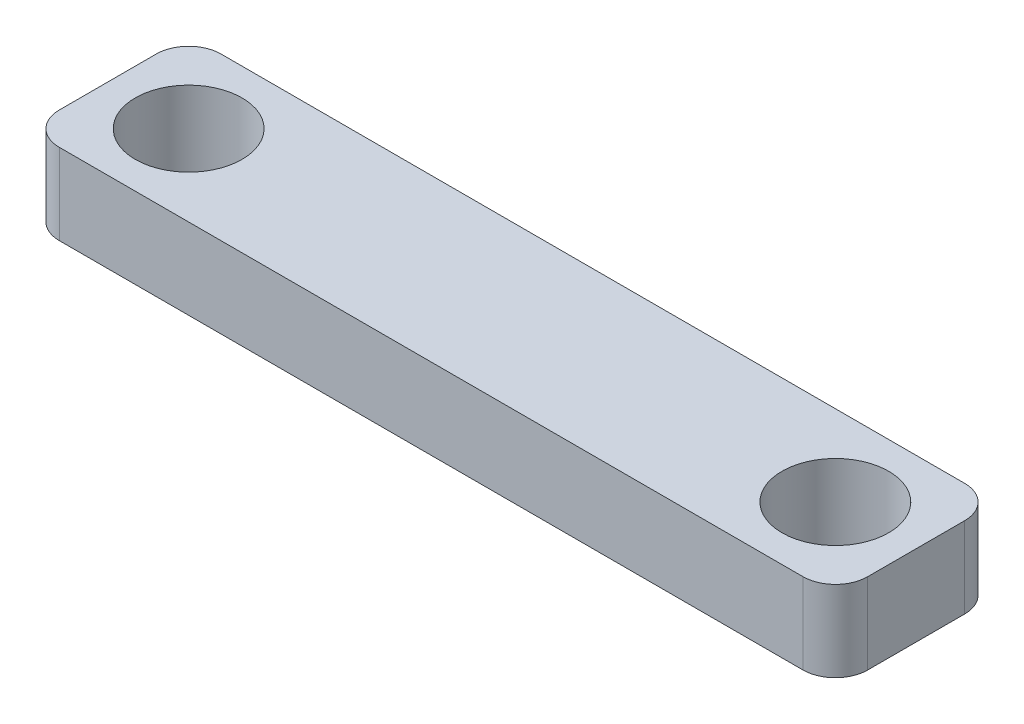
ISO-10303-21;
HEADER;
FILE_DESCRIPTION(('STEP AP214'),'2;1');
FILE_NAME('part.step','',(''),(''),'','','');
FILE_SCHEMA(('AUTOMOTIVE_DESIGN { 1 0 10303 214 1 1 1 1 }'));
ENDSEC;
DATA;
#1=APPLICATION_CONTEXT('core data for automotive mechanical design processes');
#2=APPLICATION_PROTOCOL_DEFINITION('international standard','automotive_design',2000,#1);
#3=PRODUCT_CONTEXT('',#1,'mechanical');
#4=PRODUCT('Part','Part','',(#3));
#5=PRODUCT_RELATED_PRODUCT_CATEGORY('part','',(#4));
#6=PRODUCT_DEFINITION_FORMATION('','',#4);
#7=PRODUCT_DEFINITION_CONTEXT('part definition',#1,'design');
#8=PRODUCT_DEFINITION('design','',#6,#7);
#9=PRODUCT_DEFINITION_SHAPE('','',#8);
#10=(LENGTH_UNIT() NAMED_UNIT(*) SI_UNIT(.MILLI.,.METRE.));
#11=(NAMED_UNIT(*) PLANE_ANGLE_UNIT() SI_UNIT($,.RADIAN.));
#12=(NAMED_UNIT(*) SI_UNIT($,.STERADIAN.) SOLID_ANGLE_UNIT());
#13=UNCERTAINTY_MEASURE_WITH_UNIT(LENGTH_MEASURE(1.E-05),#10,'distance_accuracy_value','');
#14=(GEOMETRIC_REPRESENTATION_CONTEXT(3) GLOBAL_UNCERTAINTY_ASSIGNED_CONTEXT((#13)) GLOBAL_UNIT_ASSIGNED_CONTEXT((#10,
#11,#12)) REPRESENTATION_CONTEXT('',''));
#15=CARTESIAN_POINT('',(0.,0.,0.));
#16=DIRECTION('',(0.,0.,1.));
#17=DIRECTION('',(1.,0.,0.));
#18=AXIS2_PLACEMENT_3D('',#15,#16,#17);
#19=CARTESIAN_POINT('',(0.,25.,0.));
#20=DIRECTION('',(0.,-1.,0.));
#21=DIRECTION('',(0.,0.,-1.));
#22=AXIS2_PLACEMENT_3D('',#19,#20,#21);
#23=PLANE('',#22);
#24=DIRECTION('',(-1.,0.,0.));
#25=VECTOR('',#24,1.);
#26=CARTESIAN_POINT('',(0.,25.,-50.));
#27=LINE('',#26,#25);
#28=CARTESIAN_POINT('',(240.,25.,-50.));
#29=VERTEX_POINT('',#28);
#30=CARTESIAN_POINT('',(10.,25.,-50.));
#31=VERTEX_POINT('',#30);
#32=EDGE_CURVE('E146',#29,#31,#27,.T.);
#33=ORIENTED_EDGE('',*,*,#32,.T.);
#34=CARTESIAN_POINT('',(10.,25.,-40.));
#35=DIRECTION('',(0.,-1.,0.));
#36=DIRECTION('',(0.,0.,-1.));
#37=AXIS2_PLACEMENT_3D('',#34,#35,#36);
#38=CIRCLE('',#37,10.);
#39=CARTESIAN_POINT('',(0.,25.,-40.));
#40=VERTEX_POINT('',#39);
#41=EDGE_CURVE('E176',#31,#40,#38,.F.);
#42=ORIENTED_EDGE('',*,*,#41,.T.);
#43=DIRECTION('',(0.,0.,1.));
#44=VECTOR('',#43,1.);
#45=CARTESIAN_POINT('',(0.,25.,0.));
#46=LINE('',#45,#44);
#47=CARTESIAN_POINT('',(0.,25.,-10.));
#48=VERTEX_POINT('',#47);
#49=EDGE_CURVE('E125',#40,#48,#46,.T.);
#50=ORIENTED_EDGE('',*,*,#49,.T.);
#51=CARTESIAN_POINT('',(10.,25.,-10.));
#52=DIRECTION('',(0.,-1.,0.));
#53=DIRECTION('',(0.,0.,-1.));
#54=AXIS2_PLACEMENT_3D('',#51,#52,#53);
#55=CIRCLE('',#54,10.);
#56=CARTESIAN_POINT('',(10.,25.,0.));
#57=VERTEX_POINT('',#56);
#58=EDGE_CURVE('E173',#48,#57,#55,.F.);
#59=ORIENTED_EDGE('',*,*,#58,.T.);
#60=DIRECTION('',(1.,0.,0.));
#61=VECTOR('',#60,1.);
#62=CARTESIAN_POINT('',(0.,25.,0.));
#63=LINE('',#62,#61);
#64=CARTESIAN_POINT('',(240.,25.,0.));
#65=VERTEX_POINT('',#64);
#66=EDGE_CURVE('E202',#57,#65,#63,.T.);
#67=ORIENTED_EDGE('',*,*,#66,.T.);
#68=CARTESIAN_POINT('',(240.,25.,-10.));
#69=DIRECTION('',(0.,-1.,0.));
#70=DIRECTION('',(0.,0.,-1.));
#71=AXIS2_PLACEMENT_3D('',#68,#69,#70);
#72=CIRCLE('',#71,10.);
#73=CARTESIAN_POINT('',(250.,25.,-10.));
#74=VERTEX_POINT('',#73);
#75=EDGE_CURVE('E59',#65,#74,#72,.F.);
#76=ORIENTED_EDGE('',*,*,#75,.T.);
#77=DIRECTION('',(0.,0.,-1.));
#78=VECTOR('',#77,1.);
#79=CARTESIAN_POINT('',(250.,25.,0.));
#80=LINE('',#79,#78);
#81=CARTESIAN_POINT('',(250.,25.,-40.));
#82=VERTEX_POINT('',#81);
#83=EDGE_CURVE('E190',#74,#82,#80,.T.);
#84=ORIENTED_EDGE('',*,*,#83,.T.);
#85=CARTESIAN_POINT('',(240.,25.,-40.));
#86=DIRECTION('',(0.,-1.,0.));
#87=DIRECTION('',(0.,0.,-1.));
#88=AXIS2_PLACEMENT_3D('',#85,#86,#87);
#89=CIRCLE('',#88,10.);
#90=EDGE_CURVE('E170',#82,#29,#89,.F.);
#91=ORIENTED_EDGE('',*,*,#90,.T.);
#92=EDGE_LOOP('',(#33,#42,#50,#59,#67,#76,#84,#91));
#93=FACE_BOUND('',#92,.T.);
#94=CARTESIAN_POINT('',(25.,25.,-25.));
#95=DIRECTION('',(0.,1.,0.));
#96=DIRECTION('',(0.,0.,1.));
#97=AXIS2_PLACEMENT_3D('',#94,#95,#96);
#98=CIRCLE('',#97,16.5);
#99=CARTESIAN_POINT('',(25.,25.,-8.5));
#100=VERTEX_POINT('',#99);
#101=EDGE_CURVE('E135',#100,#100,#98,.T.);
#102=ORIENTED_EDGE('',*,*,#101,.F.);
#103=EDGE_LOOP('',(#102));
#104=FACE_BOUND('',#103,.T.);
#105=CARTESIAN_POINT('',(225.,25.,-25.));
#106=DIRECTION('',(0.,1.,0.));
#107=DIRECTION('',(0.,0.,1.));
#108=AXIS2_PLACEMENT_3D('',#105,#106,#107);
#109=CIRCLE('',#108,16.5);
#110=CARTESIAN_POINT('',(225.,25.,-8.50000000000001));
#111=VERTEX_POINT('',#110);
#112=EDGE_CURVE('E210',#111,#111,#109,.T.);
#113=ORIENTED_EDGE('',*,*,#112,.F.);
#114=EDGE_LOOP('',(#113));
#115=FACE_BOUND('',#114,.T.);
#116=ADVANCED_FACE('F38',(#93,#104,#115),#23,.F.);
#117=CARTESIAN_POINT('',(0.,0.,0.));
#118=DIRECTION('',(0.,-1.,0.));
#119=DIRECTION('',(0.,0.,-1.));
#120=AXIS2_PLACEMENT_3D('',#117,#118,#119);
#121=PLANE('',#120);
#122=CARTESIAN_POINT('',(25.,0.,-25.));
#123=DIRECTION('',(0.,1.,0.));
#124=DIRECTION('',(0.,0.,1.));
#125=AXIS2_PLACEMENT_3D('',#122,#123,#124);
#126=CIRCLE('',#125,16.5);
#127=CARTESIAN_POINT('',(25.,0.,-8.5));
#128=VERTEX_POINT('',#127);
#129=EDGE_CURVE('E143',#128,#128,#126,.T.);
#130=ORIENTED_EDGE('',*,*,#129,.T.);
#131=EDGE_LOOP('',(#130));
#132=FACE_BOUND('',#131,.T.);
#133=DIRECTION('',(0.,0.,1.));
#134=VECTOR('',#133,1.);
#135=CARTESIAN_POINT('',(0.,0.,0.));
#136=LINE('',#135,#134);
#137=CARTESIAN_POINT('',(0.,0.,-40.));
#138=VERTEX_POINT('',#137);
#139=CARTESIAN_POINT('',(0.,0.,-10.));
#140=VERTEX_POINT('',#139);
#141=EDGE_CURVE('E122',#138,#140,#136,.T.);
#142=ORIENTED_EDGE('',*,*,#141,.F.);
#143=CARTESIAN_POINT('',(10.,0.,-40.));
#144=DIRECTION('',(0.,-1.,0.));
#145=DIRECTION('',(0.,0.,-1.));
#146=AXIS2_PLACEMENT_3D('',#143,#144,#145);
#147=CIRCLE('',#146,10.);
#148=CARTESIAN_POINT('',(10.,0.,-50.));
#149=VERTEX_POINT('',#148);
#150=EDGE_CURVE('E104',#138,#149,#147,.T.);
#151=ORIENTED_EDGE('',*,*,#150,.T.);
#152=DIRECTION('',(-1.,0.,0.));
#153=VECTOR('',#152,1.);
#154=CARTESIAN_POINT('',(0.,0.,-50.));
#155=LINE('',#154,#153);
#156=CARTESIAN_POINT('',(240.,0.,-50.));
#157=VERTEX_POINT('',#156);
#158=EDGE_CURVE('E151',#157,#149,#155,.T.);
#159=ORIENTED_EDGE('',*,*,#158,.F.);
#160=CARTESIAN_POINT('',(240.,0.,-40.));
#161=DIRECTION('',(0.,-1.,0.));
#162=DIRECTION('',(0.,0.,-1.));
#163=AXIS2_PLACEMENT_3D('',#160,#161,#162);
#164=CIRCLE('',#163,10.);
#165=CARTESIAN_POINT('',(250.,0.,-40.));
#166=VERTEX_POINT('',#165);
#167=EDGE_CURVE('E158',#157,#166,#164,.T.);
#168=ORIENTED_EDGE('',*,*,#167,.T.);
#169=DIRECTION('',(0.,0.,-1.));
#170=VECTOR('',#169,1.);
#171=CARTESIAN_POINT('',(250.,0.,0.));
#172=LINE('',#171,#170);
#173=CARTESIAN_POINT('',(250.,0.,-10.));
#174=VERTEX_POINT('',#173);
#175=EDGE_CURVE('E140',#174,#166,#172,.T.);
#176=ORIENTED_EDGE('',*,*,#175,.F.);
#177=CARTESIAN_POINT('',(240.,0.,-10.));
#178=DIRECTION('',(0.,-1.,0.));
#179=DIRECTION('',(0.,0.,-1.));
#180=AXIS2_PLACEMENT_3D('',#177,#178,#179);
#181=CIRCLE('',#180,10.);
#182=CARTESIAN_POINT('',(240.,0.,0.));
#183=VERTEX_POINT('',#182);
#184=EDGE_CURVE('E127',#174,#183,#181,.T.);
#185=ORIENTED_EDGE('',*,*,#184,.T.);
#186=DIRECTION('',(1.,0.,0.));
#187=VECTOR('',#186,1.);
#188=CARTESIAN_POINT('',(0.,0.,0.));
#189=LINE('',#188,#187);
#190=CARTESIAN_POINT('',(10.,0.,0.));
#191=VERTEX_POINT('',#190);
#192=EDGE_CURVE('E134',#191,#183,#189,.T.);
#193=ORIENTED_EDGE('',*,*,#192,.F.);
#194=CARTESIAN_POINT('',(10.,0.,-10.));
#195=DIRECTION('',(0.,-1.,0.));
#196=DIRECTION('',(0.,0.,-1.));
#197=AXIS2_PLACEMENT_3D('',#194,#195,#196);
#198=CIRCLE('',#197,10.);
#199=EDGE_CURVE('E116',#191,#140,#198,.T.);
#200=ORIENTED_EDGE('',*,*,#199,.T.);
#201=EDGE_LOOP('',(#142,#151,#159,#168,#176,#185,#193,#200));
#202=FACE_BOUND('',#201,.T.);
#203=CARTESIAN_POINT('',(225.,0.,-25.));
#204=DIRECTION('',(0.,1.,0.));
#205=DIRECTION('',(0.,0.,1.));
#206=AXIS2_PLACEMENT_3D('',#203,#204,#205);
#207=CIRCLE('',#206,16.5);
#208=CARTESIAN_POINT('',(225.,0.,-8.50000000000001));
#209=VERTEX_POINT('',#208);
#210=EDGE_CURVE('E212',#209,#209,#207,.T.);
#211=ORIENTED_EDGE('',*,*,#210,.T.);
#212=EDGE_LOOP('',(#211));
#213=FACE_BOUND('',#212,.T.);
#214=ADVANCED_FACE('F130',(#132,#202,#213),#121,.T.);
#215=CARTESIAN_POINT('',(0.,25.,0.));
#216=DIRECTION('',(1.,0.,0.));
#217=DIRECTION('',(0.,0.,-1.));
#218=AXIS2_PLACEMENT_3D('',#215,#216,#217);
#219=PLANE('',#218);
#220=ORIENTED_EDGE('',*,*,#49,.F.);
#221=DIRECTION('',(0.,-1.,0.));
#222=VECTOR('',#221,1.);
#223=CARTESIAN_POINT('',(0.,25.,-40.));
#224=LINE('',#223,#222);
#225=EDGE_CURVE('E108',#40,#138,#224,.T.);
#226=ORIENTED_EDGE('',*,*,#225,.T.);
#227=ORIENTED_EDGE('',*,*,#141,.T.);
#228=DIRECTION('',(0.,-1.,0.));
#229=VECTOR('',#228,1.);
#230=CARTESIAN_POINT('',(0.,25.,-10.));
#231=LINE('',#230,#229);
#232=EDGE_CURVE('E128',#140,#48,#231,.F.);
#233=ORIENTED_EDGE('',*,*,#232,.T.);
#234=EDGE_LOOP('',(#220,#226,#227,#233));
#235=FACE_BOUND('',#234,.T.);
#236=ADVANCED_FACE('F121',(#235),#219,.F.);
#237=CARTESIAN_POINT('',(0.,25.,0.));
#238=DIRECTION('',(0.,0.,-1.));
#239=DIRECTION('',(-1.,0.,0.));
#240=AXIS2_PLACEMENT_3D('',#237,#238,#239);
#241=PLANE('',#240);
#242=ORIENTED_EDGE('',*,*,#66,.F.);
#243=DIRECTION('',(0.,-1.,0.));
#244=VECTOR('',#243,1.);
#245=CARTESIAN_POINT('',(10.,25.,0.));
#246=LINE('',#245,#244);
#247=EDGE_CURVE('E182',#57,#191,#246,.T.);
#248=ORIENTED_EDGE('',*,*,#247,.T.);
#249=ORIENTED_EDGE('',*,*,#192,.T.);
#250=DIRECTION('',(0.,-1.,0.));
#251=VECTOR('',#250,1.);
#252=CARTESIAN_POINT('',(240.,25.,0.));
#253=LINE('',#252,#251);
#254=EDGE_CURVE('E179',#183,#65,#253,.F.);
#255=ORIENTED_EDGE('',*,*,#254,.T.);
#256=EDGE_LOOP('',(#242,#248,#249,#255));
#257=FACE_BOUND('',#256,.T.);
#258=ADVANCED_FACE('F240',(#257),#241,.F.);
#259=CARTESIAN_POINT('',(250.,25.,0.));
#260=DIRECTION('',(-1.,0.,0.));
#261=DIRECTION('',(0.,0.,1.));
#262=AXIS2_PLACEMENT_3D('',#259,#260,#261);
#263=PLANE('',#262);
#264=ORIENTED_EDGE('',*,*,#175,.T.);
#265=DIRECTION('',(0.,-1.,0.));
#266=VECTOR('',#265,1.);
#267=CARTESIAN_POINT('',(250.,25.,-40.));
#268=LINE('',#267,#266);
#269=EDGE_CURVE('E11',#166,#82,#268,.F.);
#270=ORIENTED_EDGE('',*,*,#269,.T.);
#271=ORIENTED_EDGE('',*,*,#83,.F.);
#272=DIRECTION('',(0.,-1.,0.));
#273=VECTOR('',#272,1.);
#274=CARTESIAN_POINT('',(250.,25.,-10.));
#275=LINE('',#274,#273);
#276=EDGE_CURVE('E47',#74,#174,#275,.T.);
#277=ORIENTED_EDGE('',*,*,#276,.T.);
#278=EDGE_LOOP('',(#264,#270,#271,#277));
#279=FACE_BOUND('',#278,.T.);
#280=ADVANCED_FACE('F189',(#279),#263,.F.);
#281=CARTESIAN_POINT('',(0.,25.,-50.));
#282=DIRECTION('',(0.,0.,1.));
#283=DIRECTION('',(1.,0.,0.));
#284=AXIS2_PLACEMENT_3D('',#281,#282,#283);
#285=PLANE('',#284);
#286=ORIENTED_EDGE('',*,*,#158,.T.);
#287=DIRECTION('',(0.,-1.,0.));
#288=VECTOR('',#287,1.);
#289=CARTESIAN_POINT('',(10.,25.,-50.));
#290=LINE('',#289,#288);
#291=EDGE_CURVE('E109',#149,#31,#290,.F.);
#292=ORIENTED_EDGE('',*,*,#291,.T.);
#293=ORIENTED_EDGE('',*,*,#32,.F.);
#294=DIRECTION('',(0.,-1.,0.));
#295=VECTOR('',#294,1.);
#296=CARTESIAN_POINT('',(240.,25.,-50.));
#297=LINE('',#296,#295);
#298=EDGE_CURVE('E115',#29,#157,#297,.T.);
#299=ORIENTED_EDGE('',*,*,#298,.T.);
#300=EDGE_LOOP('',(#286,#292,#293,#299));
#301=FACE_BOUND('',#300,.T.);
#302=ADVANCED_FACE('F198',(#301),#285,.F.);
#303=CARTESIAN_POINT('',(25.,25.,-25.));
#304=DIRECTION('',(0.,-1.,0.));
#305=DIRECTION('',(0.,0.,-1.));
#306=AXIS2_PLACEMENT_3D('',#303,#304,#305);
#307=CYLINDRICAL_SURFACE('',#306,16.5);
#308=ORIENTED_EDGE('',*,*,#101,.T.);
#309=EDGE_LOOP('',(#308));
#310=FACE_BOUND('',#309,.T.);
#311=ORIENTED_EDGE('',*,*,#129,.F.);
#312=EDGE_LOOP('',(#311));
#313=FACE_BOUND('',#312,.T.);
#314=ADVANCED_FACE('F233',(#310,#313),#307,.F.);
#315=CARTESIAN_POINT('',(225.,25.,-25.));
#316=DIRECTION('',(0.,-1.,0.));
#317=DIRECTION('',(0.,0.,-1.));
#318=AXIS2_PLACEMENT_3D('',#315,#316,#317);
#319=CYLINDRICAL_SURFACE('',#318,16.5);
#320=ORIENTED_EDGE('',*,*,#112,.T.);
#321=EDGE_LOOP('',(#320));
#322=FACE_BOUND('',#321,.T.);
#323=ORIENTED_EDGE('',*,*,#210,.F.);
#324=EDGE_LOOP('',(#323));
#325=FACE_BOUND('',#324,.T.);
#326=ADVANCED_FACE('F220',(#322,#325),#319,.F.);
#327=CARTESIAN_POINT('',(10.,25.,-40.));
#328=DIRECTION('',(0.,-1.,0.));
#329=DIRECTION('',(0.,0.,-1.));
#330=AXIS2_PLACEMENT_3D('',#327,#328,#329);
#331=CYLINDRICAL_SURFACE('',#330,10.);
#332=ORIENTED_EDGE('',*,*,#41,.F.);
#333=ORIENTED_EDGE('',*,*,#291,.F.);
#334=ORIENTED_EDGE('',*,*,#150,.F.);
#335=ORIENTED_EDGE('',*,*,#225,.F.);
#336=EDGE_LOOP('',(#332,#333,#334,#335));
#337=FACE_BOUND('',#336,.T.);
#338=ADVANCED_FACE('F107',(#337),#331,.T.);
#339=CARTESIAN_POINT('',(10.,25.,-10.));
#340=DIRECTION('',(0.,-1.,0.));
#341=DIRECTION('',(0.,0.,-1.));
#342=AXIS2_PLACEMENT_3D('',#339,#340,#341);
#343=CYLINDRICAL_SURFACE('',#342,10.);
#344=ORIENTED_EDGE('',*,*,#58,.F.);
#345=ORIENTED_EDGE('',*,*,#232,.F.);
#346=ORIENTED_EDGE('',*,*,#199,.F.);
#347=ORIENTED_EDGE('',*,*,#247,.F.);
#348=EDGE_LOOP('',(#344,#345,#346,#347));
#349=FACE_BOUND('',#348,.T.);
#350=ADVANCED_FACE('F248',(#349),#343,.T.);
#351=CARTESIAN_POINT('',(240.,25.,-40.));
#352=DIRECTION('',(0.,-1.,0.));
#353=DIRECTION('',(0.,0.,-1.));
#354=AXIS2_PLACEMENT_3D('',#351,#352,#353);
#355=CYLINDRICAL_SURFACE('',#354,10.);
#356=ORIENTED_EDGE('',*,*,#90,.F.);
#357=ORIENTED_EDGE('',*,*,#269,.F.);
#358=ORIENTED_EDGE('',*,*,#167,.F.);
#359=ORIENTED_EDGE('',*,*,#298,.F.);
#360=EDGE_LOOP('',(#356,#357,#358,#359));
#361=FACE_BOUND('',#360,.T.);
#362=ADVANCED_FACE('F195',(#361),#355,.T.);
#363=CARTESIAN_POINT('',(240.,25.,-10.));
#364=DIRECTION('',(0.,-1.,0.));
#365=DIRECTION('',(0.,0.,-1.));
#366=AXIS2_PLACEMENT_3D('',#363,#364,#365);
#367=CYLINDRICAL_SURFACE('',#366,10.);
#368=ORIENTED_EDGE('',*,*,#75,.F.);
#369=ORIENTED_EDGE('',*,*,#254,.F.);
#370=ORIENTED_EDGE('',*,*,#184,.F.);
#371=ORIENTED_EDGE('',*,*,#276,.F.);
#372=EDGE_LOOP('',(#368,#369,#370,#371));
#373=FACE_BOUND('',#372,.T.);
#374=ADVANCED_FACE('F40',(#373),#367,.T.);
#375=CLOSED_SHELL('',(#116,#214,#236,#258,#280,#302,#314,#326,#338,#350,#362,#374));
#376=MANIFOLD_SOLID_BREP('B2',#375);
#377=ADVANCED_BREP_SHAPE_REPRESENTATION('',(#18,#376),#14);
#378=SHAPE_DEFINITION_REPRESENTATION(#9,#377);
ENDSEC;
END-ISO-10303-21;
